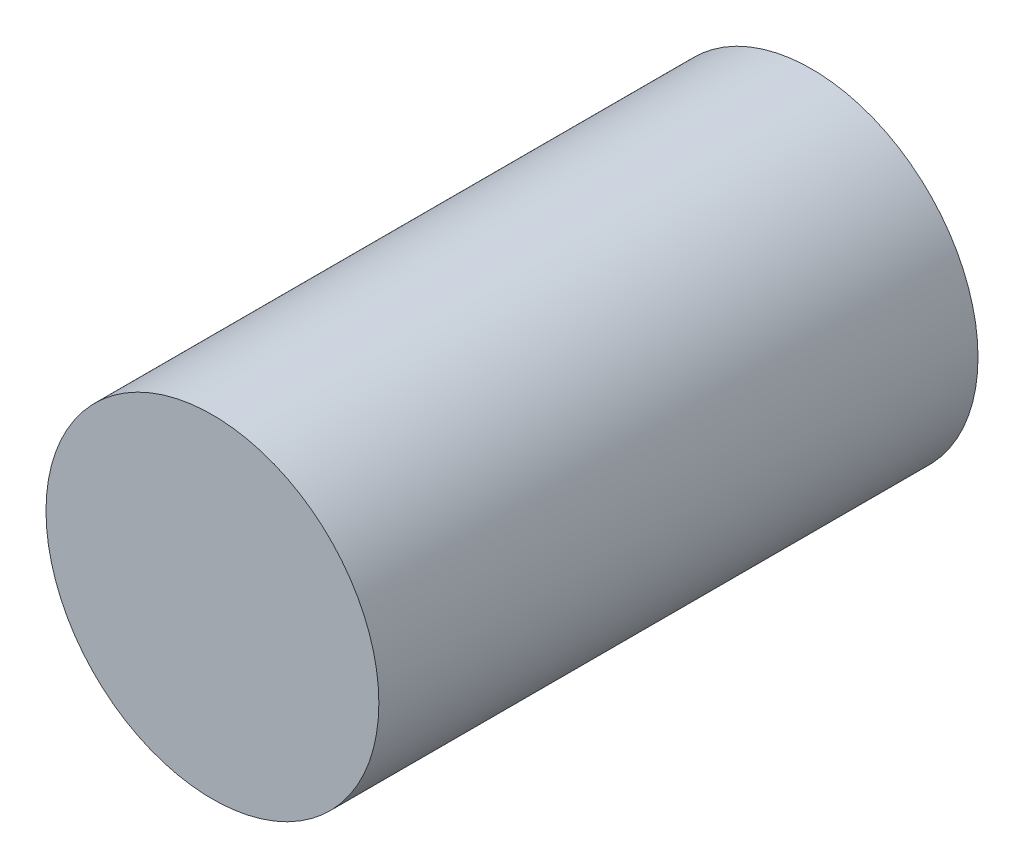
ISO-10303-21;
HEADER;
FILE_DESCRIPTION(('STEP AP214'),'2;1');
FILE_NAME('part.step','',(''),(''),'','','');
FILE_SCHEMA(('AUTOMOTIVE_DESIGN { 1 0 10303 214 1 1 1 1 }'));
ENDSEC;
DATA;
#1=APPLICATION_CONTEXT('core data for automotive mechanical design processes');
#2=APPLICATION_PROTOCOL_DEFINITION('international standard','automotive_design',2000,#1);
#3=PRODUCT_CONTEXT('',#1,'mechanical');
#4=PRODUCT('Part','Part','',(#3));
#5=PRODUCT_RELATED_PRODUCT_CATEGORY('part','',(#4));
#6=PRODUCT_DEFINITION_FORMATION('','',#4);
#7=PRODUCT_DEFINITION_CONTEXT('part definition',#1,'design');
#8=PRODUCT_DEFINITION('design','',#6,#7);
#9=PRODUCT_DEFINITION_SHAPE('','',#8);
#10=(LENGTH_UNIT() NAMED_UNIT(*) SI_UNIT(.MILLI.,.METRE.));
#11=(NAMED_UNIT(*) PLANE_ANGLE_UNIT() SI_UNIT($,.RADIAN.));
#12=(NAMED_UNIT(*) SI_UNIT($,.STERADIAN.) SOLID_ANGLE_UNIT());
#13=UNCERTAINTY_MEASURE_WITH_UNIT(LENGTH_MEASURE(1.E-05),#10,'distance_accuracy_value','');
#14=(GEOMETRIC_REPRESENTATION_CONTEXT(3) GLOBAL_UNCERTAINTY_ASSIGNED_CONTEXT((#13)) GLOBAL_UNIT_ASSIGNED_CONTEXT((#10,
#11,#12)) REPRESENTATION_CONTEXT('',''));
#15=CARTESIAN_POINT('',(0.,0.,0.));
#16=DIRECTION('',(0.,0.,1.));
#17=DIRECTION('',(1.,0.,0.));
#18=AXIS2_PLACEMENT_3D('',#15,#16,#17);
#19=CARTESIAN_POINT('',(0.,0.,18.));
#20=DIRECTION('',(0.,0.,-1.));
#21=DIRECTION('',(-1.,0.,0.));
#22=AXIS2_PLACEMENT_3D('',#19,#20,#21);
#23=CYLINDRICAL_SURFACE('',#22,5.);
#24=CARTESIAN_POINT('',(0.,0.,18.));
#25=DIRECTION('',(0.,0.,1.));
#26=DIRECTION('',(1.,0.,0.));
#27=AXIS2_PLACEMENT_3D('',#24,#25,#26);
#28=CIRCLE('',#27,5.);
#29=CARTESIAN_POINT('',(5.,0.,18.));
#30=VERTEX_POINT('',#29);
#31=EDGE_CURVE('E10',#30,#30,#28,.T.);
#32=ORIENTED_EDGE('',*,*,#31,.F.);
#33=EDGE_LOOP('',(#32));
#34=FACE_BOUND('',#33,.T.);
#35=CARTESIAN_POINT('',(0.,0.,0.));
#36=DIRECTION('',(0.,0.,1.));
#37=DIRECTION('',(1.,0.,0.));
#38=AXIS2_PLACEMENT_3D('',#35,#36,#37);
#39=CIRCLE('',#38,5.);
#40=CARTESIAN_POINT('',(5.,0.,0.));
#41=VERTEX_POINT('',#40);
#42=EDGE_CURVE('E34',#41,#41,#39,.T.);
#43=ORIENTED_EDGE('',*,*,#42,.T.);
#44=EDGE_LOOP('',(#43));
#45=FACE_BOUND('',#44,.T.);
#46=ADVANCED_FACE('F31',(#34,#45),#23,.T.);
#47=CARTESIAN_POINT('',(0.,0.,18.));
#48=DIRECTION('',(0.,0.,1.));
#49=DIRECTION('',(1.,0.,0.));
#50=AXIS2_PLACEMENT_3D('',#47,#48,#49);
#51=PLANE('',#50);
#52=ORIENTED_EDGE('',*,*,#31,.T.);
#53=EDGE_LOOP('',(#52));
#54=FACE_BOUND('',#53,.T.);
#55=ADVANCED_FACE('F46',(#54),#51,.T.);
#56=CARTESIAN_POINT('',(0.,0.,0.));
#57=DIRECTION('',(0.,0.,1.));
#58=DIRECTION('',(1.,0.,0.));
#59=AXIS2_PLACEMENT_3D('',#56,#57,#58);
#60=PLANE('',#59);
#61=ORIENTED_EDGE('',*,*,#42,.F.);
#62=EDGE_LOOP('',(#61));
#63=FACE_BOUND('',#62,.T.);
#64=ADVANCED_FACE('F44',(#63),#60,.F.);
#65=CLOSED_SHELL('',(#46,#55,#64));
#66=MANIFOLD_SOLID_BREP('B2',#65);
#67=ADVANCED_BREP_SHAPE_REPRESENTATION('',(#18,#66),#14);
#68=SHAPE_DEFINITION_REPRESENTATION(#9,#67);
ENDSEC;
END-ISO-10303-21;
